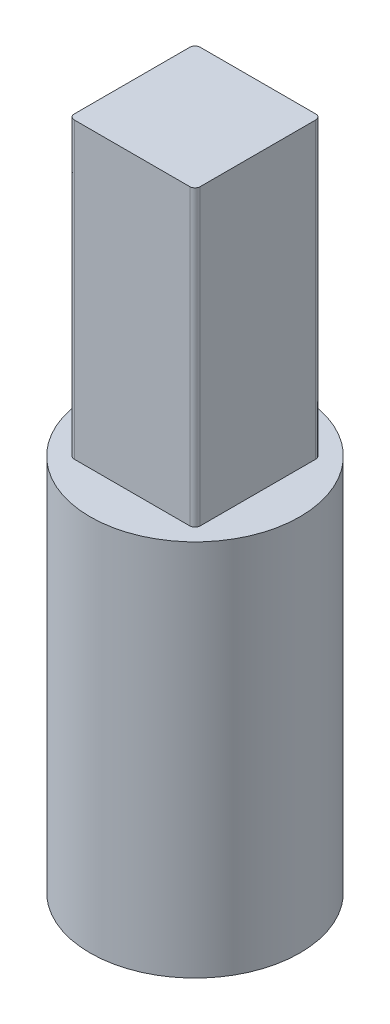
ISO-10303-21;
HEADER;
FILE_DESCRIPTION(('STEP AP214'),'2;1');
FILE_NAME('part.step','',(''),(''),'','','');
FILE_SCHEMA(('AUTOMOTIVE_DESIGN { 1 0 10303 214 1 1 1 1 }'));
ENDSEC;
DATA;
#1=APPLICATION_CONTEXT('core data for automotive mechanical design processes');
#2=APPLICATION_PROTOCOL_DEFINITION('international standard','automotive_design',2000,#1);
#3=PRODUCT_CONTEXT('',#1,'mechanical');
#4=PRODUCT('Part','Part','',(#3));
#5=PRODUCT_RELATED_PRODUCT_CATEGORY('part','',(#4));
#6=PRODUCT_DEFINITION_FORMATION('','',#4);
#7=PRODUCT_DEFINITION_CONTEXT('part definition',#1,'design');
#8=PRODUCT_DEFINITION('design','',#6,#7);
#9=PRODUCT_DEFINITION_SHAPE('','',#8);
#10=(LENGTH_UNIT() NAMED_UNIT(*) SI_UNIT(.MILLI.,.METRE.));
#11=(NAMED_UNIT(*) PLANE_ANGLE_UNIT() SI_UNIT($,.RADIAN.));
#12=(NAMED_UNIT(*) SI_UNIT($,.STERADIAN.) SOLID_ANGLE_UNIT());
#13=UNCERTAINTY_MEASURE_WITH_UNIT(LENGTH_MEASURE(1.E-05),#10,'distance_accuracy_value','');
#14=(GEOMETRIC_REPRESENTATION_CONTEXT(3) GLOBAL_UNCERTAINTY_ASSIGNED_CONTEXT((#13)) GLOBAL_UNIT_ASSIGNED_CONTEXT((#10,
#11,#12)) REPRESENTATION_CONTEXT('',''));
#15=CARTESIAN_POINT('',(0.,0.,0.));
#16=DIRECTION('',(0.,0.,1.));
#17=DIRECTION('',(1.,0.,0.));
#18=AXIS2_PLACEMENT_3D('',#15,#16,#17);
#19=CARTESIAN_POINT('',(-76.2,355.6,-76.2));
#20=DIRECTION('',(1.,0.,0.));
#21=DIRECTION('',(0.,0.,-1.));
#22=AXIS2_PLACEMENT_3D('',#19,#20,#21);
#23=PLANE('',#22);
#24=DIRECTION('',(0.,0.,1.));
#25=VECTOR('',#24,1.);
#26=CARTESIAN_POINT('',(-76.2,355.6,-76.2));
#27=LINE('',#26,#25);
#28=CARTESIAN_POINT('',(-76.2,355.6,-69.85));
#29=VERTEX_POINT('',#28);
#30=CARTESIAN_POINT('',(-76.2,355.6,69.85));
#31=VERTEX_POINT('',#30);
#32=EDGE_CURVE('E129',#29,#31,#27,.T.);
#33=ORIENTED_EDGE('',*,*,#32,.F.);
#34=DIRECTION('',(0.,-1.,0.));
#35=VECTOR('',#34,1.);
#36=CARTESIAN_POINT('',(-76.2,355.6,-69.85));
#37=LINE('',#36,#35);
#38=CARTESIAN_POINT('',(-76.2,0.,-69.85));
#39=VERTEX_POINT('',#38);
#40=EDGE_CURVE('E13',#29,#39,#37,.T.);
#41=ORIENTED_EDGE('',*,*,#40,.T.);
#42=DIRECTION('',(0.,0.,1.));
#43=VECTOR('',#42,1.);
#44=CARTESIAN_POINT('',(-76.2,0.,-76.2));
#45=LINE('',#44,#43);
#46=CARTESIAN_POINT('',(-76.2,0.,69.85));
#47=VERTEX_POINT('',#46);
#48=EDGE_CURVE('E135',#39,#47,#45,.T.);
#49=ORIENTED_EDGE('',*,*,#48,.T.);
#50=DIRECTION('',(0.,-1.,0.));
#51=VECTOR('',#50,1.);
#52=CARTESIAN_POINT('',(-76.2,355.6,69.85));
#53=LINE('',#52,#51);
#54=EDGE_CURVE('E52',#47,#31,#53,.F.);
#55=ORIENTED_EDGE('',*,*,#54,.T.);
#56=EDGE_LOOP('',(#33,#41,#49,#55));
#57=FACE_BOUND('',#56,.T.);
#58=ADVANCED_FACE('F44',(#57),#23,.F.);
#59=CARTESIAN_POINT('',(-76.2,355.6,76.2));
#60=DIRECTION('',(0.,0.,-1.));
#61=DIRECTION('',(-1.,0.,0.));
#62=AXIS2_PLACEMENT_3D('',#59,#60,#61);
#63=PLANE('',#62);
#64=DIRECTION('',(1.,0.,0.));
#65=VECTOR('',#64,1.);
#66=CARTESIAN_POINT('',(-76.2,0.,76.2));
#67=LINE('',#66,#65);
#68=CARTESIAN_POINT('',(-69.85,0.,76.2));
#69=VERTEX_POINT('',#68);
#70=CARTESIAN_POINT('',(69.85,0.,76.2));
#71=VERTEX_POINT('',#70);
#72=EDGE_CURVE('E171',#69,#71,#67,.T.);
#73=ORIENTED_EDGE('',*,*,#72,.T.);
#74=DIRECTION('',(0.,-1.,0.));
#75=VECTOR('',#74,1.);
#76=CARTESIAN_POINT('',(69.85,355.6,76.2));
#77=LINE('',#76,#75);
#78=CARTESIAN_POINT('',(69.85,355.6,76.2));
#79=VERTEX_POINT('',#78);
#80=EDGE_CURVE('E59',#71,#79,#77,.F.);
#81=ORIENTED_EDGE('',*,*,#80,.T.);
#82=DIRECTION('',(1.,0.,0.));
#83=VECTOR('',#82,1.);
#84=CARTESIAN_POINT('',(-76.2,355.6,76.2));
#85=LINE('',#84,#83);
#86=CARTESIAN_POINT('',(-69.85,355.6,76.2));
#87=VERTEX_POINT('',#86);
#88=EDGE_CURVE('E166',#87,#79,#85,.T.);
#89=ORIENTED_EDGE('',*,*,#88,.F.);
#90=DIRECTION('',(0.,-1.,0.));
#91=VECTOR('',#90,1.);
#92=CARTESIAN_POINT('',(-69.85,355.6,76.2));
#93=LINE('',#92,#91);
#94=EDGE_CURVE('E157',#87,#69,#93,.T.);
#95=ORIENTED_EDGE('',*,*,#94,.T.);
#96=EDGE_LOOP('',(#73,#81,#89,#95));
#97=FACE_BOUND('',#96,.T.);
#98=ADVANCED_FACE('F170',(#97),#63,.F.);
#99=CARTESIAN_POINT('',(76.2,355.6,-76.2));
#100=DIRECTION('',(-1.,0.,0.));
#101=DIRECTION('',(0.,0.,1.));
#102=AXIS2_PLACEMENT_3D('',#99,#100,#101);
#103=PLANE('',#102);
#104=DIRECTION('',(0.,0.,-1.));
#105=VECTOR('',#104,1.);
#106=CARTESIAN_POINT('',(76.2,0.,-76.2));
#107=LINE('',#106,#105);
#108=CARTESIAN_POINT('',(76.2,0.,69.85));
#109=VERTEX_POINT('',#108);
#110=CARTESIAN_POINT('',(76.2,0.,-69.85));
#111=VERTEX_POINT('',#110);
#112=EDGE_CURVE('E130',#109,#111,#107,.T.);
#113=ORIENTED_EDGE('',*,*,#112,.T.);
#114=DIRECTION('',(0.,-1.,0.));
#115=VECTOR('',#114,1.);
#116=CARTESIAN_POINT('',(76.2,355.6,-69.85));
#117=LINE('',#116,#115);
#118=CARTESIAN_POINT('',(76.2,355.6,-69.85));
#119=VERTEX_POINT('',#118);
#120=EDGE_CURVE('E149',#111,#119,#117,.F.);
#121=ORIENTED_EDGE('',*,*,#120,.T.);
#122=DIRECTION('',(0.,0.,-1.));
#123=VECTOR('',#122,1.);
#124=CARTESIAN_POINT('',(76.2,355.6,-76.2));
#125=LINE('',#124,#123);
#126=CARTESIAN_POINT('',(76.2,355.6,69.85));
#127=VERTEX_POINT('',#126);
#128=EDGE_CURVE('E179',#127,#119,#125,.T.);
#129=ORIENTED_EDGE('',*,*,#128,.F.);
#130=DIRECTION('',(0.,-1.,0.));
#131=VECTOR('',#130,1.);
#132=CARTESIAN_POINT('',(76.2,355.6,69.85));
#133=LINE('',#132,#131);
#134=EDGE_CURVE('E146',#127,#109,#133,.T.);
#135=ORIENTED_EDGE('',*,*,#134,.T.);
#136=EDGE_LOOP('',(#113,#121,#129,#135));
#137=FACE_BOUND('',#136,.T.);
#138=ADVANCED_FACE('F207',(#137),#103,.F.);
#139=CARTESIAN_POINT('',(-76.2,355.6,-76.2));
#140=DIRECTION('',(0.,0.,1.));
#141=DIRECTION('',(1.,0.,0.));
#142=AXIS2_PLACEMENT_3D('',#139,#140,#141);
#143=PLANE('',#142);
#144=DIRECTION('',(-1.,0.,0.));
#145=VECTOR('',#144,1.);
#146=CARTESIAN_POINT('',(-76.2,355.6,-76.2));
#147=LINE('',#146,#145);
#148=CARTESIAN_POINT('',(69.85,355.6,-76.2));
#149=VERTEX_POINT('',#148);
#150=CARTESIAN_POINT('',(-69.85,355.6,-76.2));
#151=VERTEX_POINT('',#150);
#152=EDGE_CURVE('E120',#149,#151,#147,.T.);
#153=ORIENTED_EDGE('',*,*,#152,.F.);
#154=DIRECTION('',(0.,-1.,0.));
#155=VECTOR('',#154,1.);
#156=CARTESIAN_POINT('',(69.85,355.6,-76.2));
#157=LINE('',#156,#155);
#158=CARTESIAN_POINT('',(69.85,0.,-76.2));
#159=VERTEX_POINT('',#158);
#160=EDGE_CURVE('E119',#149,#159,#157,.T.);
#161=ORIENTED_EDGE('',*,*,#160,.T.);
#162=DIRECTION('',(-1.,0.,0.));
#163=VECTOR('',#162,1.);
#164=CARTESIAN_POINT('',(-76.2,0.,-76.2));
#165=LINE('',#164,#163);
#166=CARTESIAN_POINT('',(-69.85,0.,-76.2));
#167=VERTEX_POINT('',#166);
#168=EDGE_CURVE('E124',#159,#167,#165,.T.);
#169=ORIENTED_EDGE('',*,*,#168,.T.);
#170=DIRECTION('',(0.,-1.,0.));
#171=VECTOR('',#170,1.);
#172=CARTESIAN_POINT('',(-69.85,355.6,-76.2));
#173=LINE('',#172,#171);
#174=EDGE_CURVE('E109',#167,#151,#173,.F.);
#175=ORIENTED_EDGE('',*,*,#174,.T.);
#176=EDGE_LOOP('',(#153,#161,#169,#175));
#177=FACE_BOUND('',#176,.T.);
#178=ADVANCED_FACE('F125',(#177),#143,.F.);
#179=CARTESIAN_POINT('',(0.,355.6,0.));
#180=DIRECTION('',(0.,1.,0.));
#181=DIRECTION('',(0.,0.,1.));
#182=AXIS2_PLACEMENT_3D('',#179,#180,#181);
#183=PLANE('',#182);
#184=ORIENTED_EDGE('',*,*,#128,.T.);
#185=CARTESIAN_POINT('',(69.85,355.6,-69.85));
#186=DIRECTION('',(0.,1.,0.));
#187=DIRECTION('',(0.,0.,1.));
#188=AXIS2_PLACEMENT_3D('',#185,#186,#187);
#189=CIRCLE('',#188,6.35);
#190=EDGE_CURVE('E155',#119,#149,#189,.T.);
#191=ORIENTED_EDGE('',*,*,#190,.T.);
#192=ORIENTED_EDGE('',*,*,#152,.T.);
#193=CARTESIAN_POINT('',(-69.85,355.6,-69.85));
#194=DIRECTION('',(0.,1.,0.));
#195=DIRECTION('',(0.,0.,1.));
#196=AXIS2_PLACEMENT_3D('',#193,#194,#195);
#197=CIRCLE('',#196,6.35);
#198=EDGE_CURVE('E115',#151,#29,#197,.T.);
#199=ORIENTED_EDGE('',*,*,#198,.T.);
#200=ORIENTED_EDGE('',*,*,#32,.T.);
#201=CARTESIAN_POINT('',(-69.85,355.6,69.85));
#202=DIRECTION('',(0.,1.,0.));
#203=DIRECTION('',(0.,0.,1.));
#204=AXIS2_PLACEMENT_3D('',#201,#202,#203);
#205=CIRCLE('',#204,6.35);
#206=EDGE_CURVE('E66',#31,#87,#205,.T.);
#207=ORIENTED_EDGE('',*,*,#206,.T.);
#208=ORIENTED_EDGE('',*,*,#88,.T.);
#209=CARTESIAN_POINT('',(69.85,355.6,69.85));
#210=DIRECTION('',(0.,1.,0.));
#211=DIRECTION('',(0.,0.,1.));
#212=AXIS2_PLACEMENT_3D('',#209,#210,#211);
#213=CIRCLE('',#212,6.35);
#214=EDGE_CURVE('E153',#79,#127,#213,.T.);
#215=ORIENTED_EDGE('',*,*,#214,.T.);
#216=EDGE_LOOP('',(#184,#191,#192,#199,#200,#207,#208,#215));
#217=FACE_BOUND('',#216,.T.);
#218=ADVANCED_FACE('F165',(#217),#183,.T.);
#219=CARTESIAN_POINT('',(69.85,355.6,-69.85));
#220=DIRECTION('',(0.,-1.,0.));
#221=DIRECTION('',(0.,0.,-1.));
#222=AXIS2_PLACEMENT_3D('',#219,#220,#221);
#223=CYLINDRICAL_SURFACE('',#222,6.35);
#224=ORIENTED_EDGE('',*,*,#190,.F.);
#225=ORIENTED_EDGE('',*,*,#120,.F.);
#226=CARTESIAN_POINT('',(69.85,0.,-69.85));
#227=DIRECTION('',(0.,1.,0.));
#228=DIRECTION('',(0.,0.,1.));
#229=AXIS2_PLACEMENT_3D('',#226,#227,#228);
#230=CIRCLE('',#229,6.35);
#231=EDGE_CURVE('E140',#159,#111,#230,.F.);
#232=ORIENTED_EDGE('',*,*,#231,.F.);
#233=ORIENTED_EDGE('',*,*,#160,.F.);
#234=EDGE_LOOP('',(#224,#225,#232,#233));
#235=FACE_BOUND('',#234,.T.);
#236=ADVANCED_FACE('F211',(#235),#223,.T.);
#237=CARTESIAN_POINT('',(69.85,355.6,69.85));
#238=DIRECTION('',(0.,-1.,0.));
#239=DIRECTION('',(0.,0.,-1.));
#240=AXIS2_PLACEMENT_3D('',#237,#238,#239);
#241=CYLINDRICAL_SURFACE('',#240,6.35);
#242=ORIENTED_EDGE('',*,*,#214,.F.);
#243=ORIENTED_EDGE('',*,*,#80,.F.);
#244=CARTESIAN_POINT('',(69.85,0.,69.85));
#245=DIRECTION('',(0.,1.,0.));
#246=DIRECTION('',(0.,0.,1.));
#247=AXIS2_PLACEMENT_3D('',#244,#245,#246);
#248=CIRCLE('',#247,6.35);
#249=EDGE_CURVE('E136',#109,#71,#248,.F.);
#250=ORIENTED_EDGE('',*,*,#249,.F.);
#251=ORIENTED_EDGE('',*,*,#134,.F.);
#252=EDGE_LOOP('',(#242,#243,#250,#251));
#253=FACE_BOUND('',#252,.T.);
#254=ADVANCED_FACE('F214',(#253),#241,.T.);
#255=CARTESIAN_POINT('',(-69.85,355.6,-69.85));
#256=DIRECTION('',(0.,-1.,0.));
#257=DIRECTION('',(0.,0.,-1.));
#258=AXIS2_PLACEMENT_3D('',#255,#256,#257);
#259=CYLINDRICAL_SURFACE('',#258,6.35);
#260=ORIENTED_EDGE('',*,*,#198,.F.);
#261=ORIENTED_EDGE('',*,*,#174,.F.);
#262=CARTESIAN_POINT('',(-69.85,0.,-69.85));
#263=DIRECTION('',(0.,1.,0.));
#264=DIRECTION('',(0.,0.,1.));
#265=AXIS2_PLACEMENT_3D('',#262,#263,#264);
#266=CIRCLE('',#265,6.35);
#267=EDGE_CURVE('E114',#39,#167,#266,.F.);
#268=ORIENTED_EDGE('',*,*,#267,.F.);
#269=ORIENTED_EDGE('',*,*,#40,.F.);
#270=EDGE_LOOP('',(#260,#261,#268,#269));
#271=FACE_BOUND('',#270,.T.);
#272=ADVANCED_FACE('F111',(#271),#259,.T.);
#273=CARTESIAN_POINT('',(-69.85,355.6,69.85));
#274=DIRECTION('',(0.,-1.,0.));
#275=DIRECTION('',(0.,0.,-1.));
#276=AXIS2_PLACEMENT_3D('',#273,#274,#275);
#277=CYLINDRICAL_SURFACE('',#276,6.35);
#278=ORIENTED_EDGE('',*,*,#206,.F.);
#279=ORIENTED_EDGE('',*,*,#54,.F.);
#280=CARTESIAN_POINT('',(-69.85,0.,69.85));
#281=DIRECTION('',(0.,1.,0.));
#282=DIRECTION('',(0.,0.,1.));
#283=AXIS2_PLACEMENT_3D('',#280,#281,#282);
#284=CIRCLE('',#283,6.35);
#285=EDGE_CURVE('E137',#69,#47,#284,.F.);
#286=ORIENTED_EDGE('',*,*,#285,.F.);
#287=ORIENTED_EDGE('',*,*,#94,.F.);
#288=EDGE_LOOP('',(#278,#279,#286,#287));
#289=FACE_BOUND('',#288,.T.);
#290=ADVANCED_FACE('F46',(#289),#277,.T.);
#291=CARTESIAN_POINT('',(0.,0.,0.));
#292=DIRECTION('',(0.,-1.,0.));
#293=DIRECTION('',(0.,0.,-1.));
#294=AXIS2_PLACEMENT_3D('',#291,#292,#293);
#295=PLANE('',#294);
#296=CARTESIAN_POINT('',(0.,0.,0.));
#297=DIRECTION('',(0.,-1.,0.));
#298=DIRECTION('',(0.,0.,-1.));
#299=AXIS2_PLACEMENT_3D('',#296,#297,#298);
#300=CIRCLE('',#299,127.);
#301=CARTESIAN_POINT('',(0.,0.,-127.));
#302=VERTEX_POINT('',#301);
#303=EDGE_CURVE('E182',#302,#302,#300,.T.);
#304=ORIENTED_EDGE('',*,*,#303,.F.);
#305=EDGE_LOOP('',(#304));
#306=FACE_BOUND('',#305,.T.);
#307=ORIENTED_EDGE('',*,*,#168,.F.);
#308=ORIENTED_EDGE('',*,*,#231,.T.);
#309=ORIENTED_EDGE('',*,*,#112,.F.);
#310=ORIENTED_EDGE('',*,*,#249,.T.);
#311=ORIENTED_EDGE('',*,*,#72,.F.);
#312=ORIENTED_EDGE('',*,*,#285,.T.);
#313=ORIENTED_EDGE('',*,*,#48,.F.);
#314=ORIENTED_EDGE('',*,*,#267,.T.);
#315=EDGE_LOOP('',(#307,#308,#309,#310,#311,#312,#313,#314));
#316=FACE_BOUND('',#315,.T.);
#317=ADVANCED_FACE('F133',(#306,#316),#295,.F.);
#318=CARTESIAN_POINT('',(0.,-457.2,0.));
#319=DIRECTION('',(0.,1.,0.));
#320=DIRECTION('',(0.,0.,1.));
#321=AXIS2_PLACEMENT_3D('',#318,#319,#320);
#322=CYLINDRICAL_SURFACE('',#321,127.);
#323=CARTESIAN_POINT('',(0.,-457.2,0.));
#324=DIRECTION('',(0.,-1.,0.));
#325=DIRECTION('',(0.,0.,-1.));
#326=AXIS2_PLACEMENT_3D('',#323,#324,#325);
#327=CIRCLE('',#326,127.);
#328=CARTESIAN_POINT('',(0.,-457.2,-127.));
#329=VERTEX_POINT('',#328);
#330=EDGE_CURVE('E175',#329,#329,#327,.T.);
#331=ORIENTED_EDGE('',*,*,#330,.F.);
#332=EDGE_LOOP('',(#331));
#333=FACE_BOUND('',#332,.T.);
#334=ORIENTED_EDGE('',*,*,#303,.T.);
#335=EDGE_LOOP('',(#334));
#336=FACE_BOUND('',#335,.T.);
#337=ADVANCED_FACE('F190',(#333,#336),#322,.T.);
#338=CARTESIAN_POINT('',(0.,-457.2,0.));
#339=DIRECTION('',(0.,-1.,0.));
#340=DIRECTION('',(0.,0.,-1.));
#341=AXIS2_PLACEMENT_3D('',#338,#339,#340);
#342=PLANE('',#341);
#343=ORIENTED_EDGE('',*,*,#330,.T.);
#344=EDGE_LOOP('',(#343));
#345=FACE_BOUND('',#344,.T.);
#346=ADVANCED_FACE('F188',(#345),#342,.T.);
#347=CLOSED_SHELL('',(#58,#98,#138,#178,#218,#236,#254,#272,#290,#317,#337,#346));
#348=MANIFOLD_SOLID_BREP('B2',#347);
#349=ADVANCED_BREP_SHAPE_REPRESENTATION('',(#18,#348),#14);
#350=SHAPE_DEFINITION_REPRESENTATION(#9,#349);
ENDSEC;
END-ISO-10303-21;
